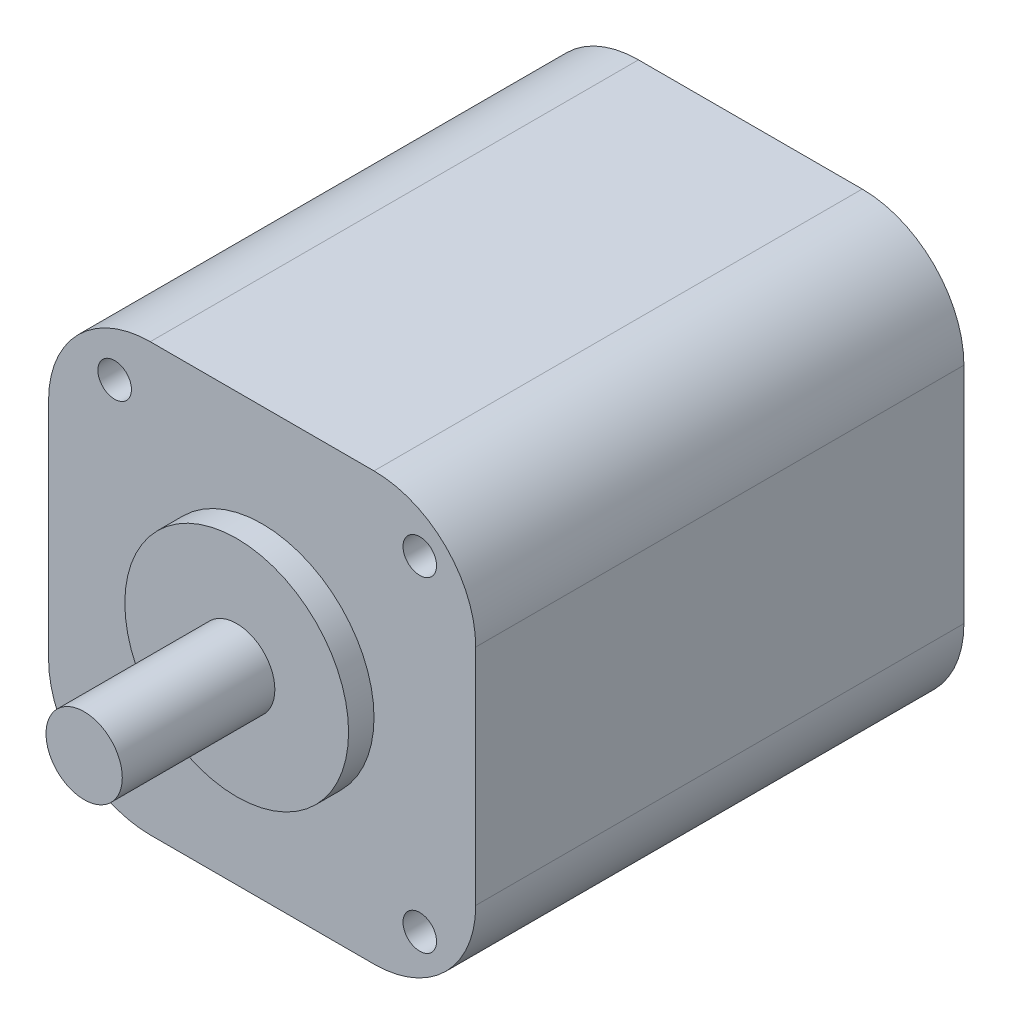
ISO-10303-21;
HEADER;
FILE_DESCRIPTION(('STEP AP214'),'2;1');
FILE_NAME('part.step','',(''),(''),'','','');
FILE_SCHEMA(('AUTOMOTIVE_DESIGN { 1 0 10303 214 1 1 1 1 }'));
ENDSEC;
DATA;
#1=APPLICATION_CONTEXT('core data for automotive mechanical design processes');
#2=APPLICATION_PROTOCOL_DEFINITION('international standard','automotive_design',2000,#1);
#3=PRODUCT_CONTEXT('',#1,'mechanical');
#4=PRODUCT('Part','Part','',(#3));
#5=PRODUCT_RELATED_PRODUCT_CATEGORY('part','',(#4));
#6=PRODUCT_DEFINITION_FORMATION('','',#4);
#7=PRODUCT_DEFINITION_CONTEXT('part definition',#1,'design');
#8=PRODUCT_DEFINITION('design','',#6,#7);
#9=PRODUCT_DEFINITION_SHAPE('','',#8);
#10=(LENGTH_UNIT() NAMED_UNIT(*) SI_UNIT(.MILLI.,.METRE.));
#11=(NAMED_UNIT(*) PLANE_ANGLE_UNIT() SI_UNIT($,.RADIAN.));
#12=(NAMED_UNIT(*) SI_UNIT($,.STERADIAN.) SOLID_ANGLE_UNIT());
#13=UNCERTAINTY_MEASURE_WITH_UNIT(LENGTH_MEASURE(1.E-05),#10,'distance_accuracy_value','');
#14=(GEOMETRIC_REPRESENTATION_CONTEXT(3) GLOBAL_UNCERTAINTY_ASSIGNED_CONTEXT((#13)) GLOBAL_UNIT_ASSIGNED_CONTEXT((#10,
#11,#12)) REPRESENTATION_CONTEXT('',''));
#15=CARTESIAN_POINT('',(0.,0.,0.));
#16=DIRECTION('',(0.,0.,1.));
#17=DIRECTION('',(1.,0.,0.));
#18=AXIS2_PLACEMENT_3D('',#15,#16,#17);
#19=CARTESIAN_POINT('',(-24.7390177664974,0.699593908629437,50.5));
#20=DIRECTION('',(0.,0.,1.));
#21=DIRECTION('',(1.,0.,0.));
#22=AXIS2_PLACEMENT_3D('',#19,#20,#21);
#23=PLANE('',#22);
#24=CARTESIAN_POINT('',(-24.7390177664974,0.699593908629437,50.5));
#25=DIRECTION('',(0.,0.,1.));
#26=DIRECTION('',(1.,0.,0.));
#27=AXIS2_PLACEMENT_3D('',#24,#25,#26);
#28=CIRCLE('',#27,11.);
#29=CARTESIAN_POINT('',(-13.7390177664974,0.699593908629437,50.5));
#30=VERTEX_POINT('',#29);
#31=EDGE_CURVE('E172',#30,#30,#28,.T.);
#32=ORIENTED_EDGE('',*,*,#31,.T.);
#33=EDGE_LOOP('',(#32));
#34=FACE_BOUND('',#33,.T.);
#35=CARTESIAN_POINT('',(-24.7390177664974,0.699593908629434,50.5));
#36=DIRECTION('',(0.,0.,1.));
#37=DIRECTION('',(1.,0.,0.));
#38=AXIS2_PLACEMENT_3D('',#35,#36,#37);
#39=CIRCLE('',#38,3.75);
#40=CARTESIAN_POINT('',(-20.9890177664974,0.699593908629434,50.5));
#41=VERTEX_POINT('',#40);
#42=EDGE_CURVE('E183',#41,#41,#39,.T.);
#43=ORIENTED_EDGE('',*,*,#42,.F.);
#44=EDGE_LOOP('',(#43));
#45=FACE_BOUND('',#44,.T.);
#46=ADVANCED_FACE('F31',(#34,#45),#23,.T.);
#47=CARTESIAN_POINT('',(-45.7390177664974,-20.3004060913706,48.));
#48=DIRECTION('',(0.,0.,1.));
#49=DIRECTION('',(1.,0.,0.));
#50=AXIS2_PLACEMENT_3D('',#47,#48,#49);
#51=PLANE('',#50);
#52=CARTESIAN_POINT('',(-9.23901776649741,16.6995939086294,48.));
#53=DIRECTION('',(0.,0.,1.));
#54=DIRECTION('',(1.,0.,0.));
#55=AXIS2_PLACEMENT_3D('',#52,#53,#54);
#56=CIRCLE('',#55,1.64999999999999);
#57=CARTESIAN_POINT('',(-7.58901776649742,16.6995939086294,48.));
#58=VERTEX_POINT('',#57);
#59=EDGE_CURVE('E206',#58,#58,#56,.T.);
#60=ORIENTED_EDGE('',*,*,#59,.F.);
#61=EDGE_LOOP('',(#60));
#62=FACE_BOUND('',#61,.T.);
#63=CARTESIAN_POINT('',(-9.23901776649741,-15.3004060913706,48.));
#64=DIRECTION('',(0.,0.,1.));
#65=DIRECTION('',(1.,0.,0.));
#66=AXIS2_PLACEMENT_3D('',#63,#64,#65);
#67=CIRCLE('',#66,1.64999999999999);
#68=CARTESIAN_POINT('',(-7.58901776649742,-15.3004060913706,48.));
#69=VERTEX_POINT('',#68);
#70=EDGE_CURVE('E200',#69,#69,#67,.T.);
#71=ORIENTED_EDGE('',*,*,#70,.F.);
#72=EDGE_LOOP('',(#71));
#73=FACE_BOUND('',#72,.T.);
#74=CARTESIAN_POINT('',(-39.2390177664974,-15.3004060913706,48.));
#75=DIRECTION('',(0.,0.,1.));
#76=DIRECTION('',(1.,0.,0.));
#77=AXIS2_PLACEMENT_3D('',#74,#75,#76);
#78=CIRCLE('',#77,1.64999999999998);
#79=CARTESIAN_POINT('',(-37.5890177664974,-15.3004060913706,48.));
#80=VERTEX_POINT('',#79);
#81=EDGE_CURVE('E194',#80,#80,#78,.T.);
#82=ORIENTED_EDGE('',*,*,#81,.F.);
#83=EDGE_LOOP('',(#82));
#84=FACE_BOUND('',#83,.T.);
#85=CARTESIAN_POINT('',(-39.2390177664974,16.6995939086294,48.));
#86=DIRECTION('',(0.,0.,1.));
#87=DIRECTION('',(1.,0.,0.));
#88=AXIS2_PLACEMENT_3D('',#85,#86,#87);
#89=CIRCLE('',#88,1.64999999999998);
#90=CARTESIAN_POINT('',(-37.5890177664974,16.6995939086294,48.));
#91=VERTEX_POINT('',#90);
#92=EDGE_CURVE('E186',#91,#91,#89,.T.);
#93=ORIENTED_EDGE('',*,*,#92,.F.);
#94=EDGE_LOOP('',(#93));
#95=FACE_BOUND('',#94,.T.);
#96=DIRECTION('',(1.,0.,0.));
#97=VECTOR('',#96,1.);
#98=CARTESIAN_POINT('',(-45.7390177664974,-20.3004060913706,48.));
#99=LINE('',#98,#97);
#100=CARTESIAN_POINT('',(-35.7390177664974,-20.3004060913706,48.));
#101=VERTEX_POINT('',#100);
#102=CARTESIAN_POINT('',(-13.7390177664974,-20.3004060913706,48.));
#103=VERTEX_POINT('',#102);
#104=EDGE_CURVE('E166',#101,#103,#99,.T.);
#105=ORIENTED_EDGE('',*,*,#104,.T.);
#106=CARTESIAN_POINT('',(-13.7390177664974,-10.3004060913706,48.));
#107=DIRECTION('',(0.,0.,1.));
#108=DIRECTION('',(1.,0.,0.));
#109=AXIS2_PLACEMENT_3D('',#106,#107,#108);
#110=CIRCLE('',#109,10.);
#111=CARTESIAN_POINT('',(-3.73901776649741,-10.3004060913705,48.));
#112=VERTEX_POINT('',#111);
#113=EDGE_CURVE('E145',#103,#112,#110,.T.);
#114=ORIENTED_EDGE('',*,*,#113,.T.);
#115=DIRECTION('',(0.,1.,0.));
#116=VECTOR('',#115,1.);
#117=CARTESIAN_POINT('',(-3.73901776649741,21.6995939086294,48.));
#118=LINE('',#117,#116);
#119=CARTESIAN_POINT('',(-3.73901776649741,11.6995939086294,48.));
#120=VERTEX_POINT('',#119);
#121=EDGE_CURVE('E116',#112,#120,#118,.T.);
#122=ORIENTED_EDGE('',*,*,#121,.T.);
#123=CARTESIAN_POINT('',(-13.7390177664974,11.6995939086294,48.));
#124=DIRECTION('',(0.,0.,1.));
#125=DIRECTION('',(1.,0.,0.));
#126=AXIS2_PLACEMENT_3D('',#123,#124,#125);
#127=CIRCLE('',#126,10.);
#128=CARTESIAN_POINT('',(-13.7390177664974,21.6995939086294,48.));
#129=VERTEX_POINT('',#128);
#130=EDGE_CURVE('E52',#120,#129,#127,.T.);
#131=ORIENTED_EDGE('',*,*,#130,.T.);
#132=DIRECTION('',(-1.,0.,0.));
#133=VECTOR('',#132,1.);
#134=CARTESIAN_POINT('',(-45.7390177664974,21.6995939086294,48.));
#135=LINE('',#134,#133);
#136=CARTESIAN_POINT('',(-35.7390177664974,21.6995939086294,48.));
#137=VERTEX_POINT('',#136);
#138=EDGE_CURVE('E132',#129,#137,#135,.T.);
#139=ORIENTED_EDGE('',*,*,#138,.T.);
#140=CARTESIAN_POINT('',(-35.7390177664974,11.6995939086294,48.));
#141=DIRECTION('',(0.,0.,1.));
#142=DIRECTION('',(1.,0.,0.));
#143=AXIS2_PLACEMENT_3D('',#140,#141,#142);
#144=CIRCLE('',#143,10.);
#145=CARTESIAN_POINT('',(-45.7390177664974,11.6995939086294,48.));
#146=VERTEX_POINT('',#145);
#147=EDGE_CURVE('E140',#137,#146,#144,.T.);
#148=ORIENTED_EDGE('',*,*,#147,.T.);
#149=DIRECTION('',(0.,-1.,0.));
#150=VECTOR('',#149,1.);
#151=CARTESIAN_POINT('',(-45.7390177664974,21.6995939086294,48.));
#152=LINE('',#151,#150);
#153=CARTESIAN_POINT('',(-45.7390177664974,-10.3004060913706,48.));
#154=VERTEX_POINT('',#153);
#155=EDGE_CURVE('E126',#146,#154,#152,.T.);
#156=ORIENTED_EDGE('',*,*,#155,.T.);
#157=CARTESIAN_POINT('',(-35.7390177664974,-10.3004060913706,48.));
#158=DIRECTION('',(0.,0.,1.));
#159=DIRECTION('',(1.,0.,0.));
#160=AXIS2_PLACEMENT_3D('',#157,#158,#159);
#161=CIRCLE('',#160,10.);
#162=EDGE_CURVE('E143',#154,#101,#161,.T.);
#163=ORIENTED_EDGE('',*,*,#162,.T.);
#164=EDGE_LOOP('',(#105,#114,#122,#131,#139,#148,#156,#163));
#165=FACE_BOUND('',#164,.T.);
#166=CARTESIAN_POINT('',(-24.7390177664974,0.699593908629437,48.));
#167=DIRECTION('',(0.,0.,1.));
#168=DIRECTION('',(1.,0.,0.));
#169=AXIS2_PLACEMENT_3D('',#166,#167,#168);
#170=CIRCLE('',#169,11.);
#171=CARTESIAN_POINT('',(-13.7390177664974,0.699593908629437,48.));
#172=VERTEX_POINT('',#171);
#173=EDGE_CURVE('E174',#172,#172,#170,.T.);
#174=ORIENTED_EDGE('',*,*,#173,.F.);
#175=EDGE_LOOP('',(#174));
#176=FACE_BOUND('',#175,.T.);
#177=ADVANCED_FACE('F162',(#62,#73,#84,#95,#165,#176),#51,.T.);
#178=CARTESIAN_POINT('',(-45.7390177664974,21.6995939086294,48.));
#179=DIRECTION('',(1.,0.,0.));
#180=DIRECTION('',(0.,1.,0.));
#181=AXIS2_PLACEMENT_3D('',#178,#179,#180);
#182=PLANE('',#181);
#183=DIRECTION('',(0.,-1.,0.));
#184=VECTOR('',#183,1.);
#185=CARTESIAN_POINT('',(-45.7390177664974,21.6995939086294,0.));
#186=LINE('',#185,#184);
#187=CARTESIAN_POINT('',(-45.7390177664974,11.6995939086294,0.));
#188=VERTEX_POINT('',#187);
#189=CARTESIAN_POINT('',(-45.7390177664974,-10.3004060913706,0.));
#190=VERTEX_POINT('',#189);
#191=EDGE_CURVE('E128',#188,#190,#186,.T.);
#192=ORIENTED_EDGE('',*,*,#191,.T.);
#193=DIRECTION('',(0.,0.,-1.));
#194=VECTOR('',#193,1.);
#195=CARTESIAN_POINT('',(-45.7390177664974,-10.3004060913706,48.));
#196=LINE('',#195,#194);
#197=EDGE_CURVE('E150',#190,#154,#196,.F.);
#198=ORIENTED_EDGE('',*,*,#197,.T.);
#199=ORIENTED_EDGE('',*,*,#155,.F.);
#200=DIRECTION('',(0.,0.,-1.));
#201=VECTOR('',#200,1.);
#202=CARTESIAN_POINT('',(-45.7390177664974,11.6995939086294,48.));
#203=LINE('',#202,#201);
#204=EDGE_CURVE('E147',#146,#188,#203,.T.);
#205=ORIENTED_EDGE('',*,*,#204,.T.);
#206=EDGE_LOOP('',(#192,#198,#199,#205));
#207=FACE_BOUND('',#206,.T.);
#208=ADVANCED_FACE('F156',(#207),#182,.F.);
#209=CARTESIAN_POINT('',(-45.7390177664974,-20.3004060913706,48.));
#210=DIRECTION('',(0.,1.,0.));
#211=DIRECTION('',(0.,0.,1.));
#212=AXIS2_PLACEMENT_3D('',#209,#210,#211);
#213=PLANE('',#212);
#214=DIRECTION('',(1.,0.,0.));
#215=VECTOR('',#214,1.);
#216=CARTESIAN_POINT('',(-45.7390177664974,-20.3004060913706,0.));
#217=LINE('',#216,#215);
#218=CARTESIAN_POINT('',(-35.7390177664974,-20.3004060913706,0.));
#219=VERTEX_POINT('',#218);
#220=CARTESIAN_POINT('',(-13.7390177664974,-20.3004060913706,0.));
#221=VERTEX_POINT('',#220);
#222=EDGE_CURVE('E124',#219,#221,#217,.T.);
#223=ORIENTED_EDGE('',*,*,#222,.T.);
#224=DIRECTION('',(0.,0.,-1.));
#225=VECTOR('',#224,1.);
#226=CARTESIAN_POINT('',(-13.7390177664974,-20.3004060913706,48.));
#227=LINE('',#226,#225);
#228=EDGE_CURVE('E102',#221,#103,#227,.F.);
#229=ORIENTED_EDGE('',*,*,#228,.T.);
#230=ORIENTED_EDGE('',*,*,#104,.F.);
#231=DIRECTION('',(0.,0.,-1.));
#232=VECTOR('',#231,1.);
#233=CARTESIAN_POINT('',(-35.7390177664974,-20.3004060913706,48.));
#234=LINE('',#233,#232);
#235=EDGE_CURVE('E107',#101,#219,#234,.T.);
#236=ORIENTED_EDGE('',*,*,#235,.T.);
#237=EDGE_LOOP('',(#223,#229,#230,#236));
#238=FACE_BOUND('',#237,.T.);
#239=ADVANCED_FACE('F171',(#238),#213,.F.);
#240=CARTESIAN_POINT('',(-3.73901776649741,21.6995939086294,48.));
#241=DIRECTION('',(-1.,0.,0.));
#242=DIRECTION('',(0.,-1.,0.));
#243=AXIS2_PLACEMENT_3D('',#240,#241,#242);
#244=PLANE('',#243);
#245=ORIENTED_EDGE('',*,*,#121,.F.);
#246=DIRECTION('',(0.,0.,-1.));
#247=VECTOR('',#246,1.);
#248=CARTESIAN_POINT('',(-3.73901776649741,-10.3004060913706,48.));
#249=LINE('',#248,#247);
#250=CARTESIAN_POINT('',(-3.73901776649741,-10.3004060913705,0.));
#251=VERTEX_POINT('',#250);
#252=EDGE_CURVE('E101',#112,#251,#249,.T.);
#253=ORIENTED_EDGE('',*,*,#252,.T.);
#254=DIRECTION('',(0.,1.,0.));
#255=VECTOR('',#254,1.);
#256=CARTESIAN_POINT('',(-3.73901776649741,21.6995939086294,0.));
#257=LINE('',#256,#255);
#258=CARTESIAN_POINT('',(-3.73901776649741,11.6995939086294,0.));
#259=VERTEX_POINT('',#258);
#260=EDGE_CURVE('E114',#251,#259,#257,.T.);
#261=ORIENTED_EDGE('',*,*,#260,.T.);
#262=DIRECTION('',(0.,0.,-1.));
#263=VECTOR('',#262,1.);
#264=CARTESIAN_POINT('',(-3.73901776649741,11.6995939086294,48.));
#265=LINE('',#264,#263);
#266=EDGE_CURVE('E118',#259,#120,#265,.F.);
#267=ORIENTED_EDGE('',*,*,#266,.T.);
#268=EDGE_LOOP('',(#245,#253,#261,#267));
#269=FACE_BOUND('',#268,.T.);
#270=ADVANCED_FACE('F113',(#269),#244,.F.);
#271=CARTESIAN_POINT('',(-45.7390177664974,21.6995939086294,48.));
#272=DIRECTION('',(0.,-1.,0.));
#273=DIRECTION('',(0.,0.,-1.));
#274=AXIS2_PLACEMENT_3D('',#271,#272,#273);
#275=PLANE('',#274);
#276=ORIENTED_EDGE('',*,*,#138,.F.);
#277=DIRECTION('',(0.,0.,-1.));
#278=VECTOR('',#277,1.);
#279=CARTESIAN_POINT('',(-13.7390177664974,21.6995939086294,48.));
#280=LINE('',#279,#278);
#281=CARTESIAN_POINT('',(-13.7390177664974,21.6995939086294,0.));
#282=VERTEX_POINT('',#281);
#283=EDGE_CURVE('E11',#129,#282,#280,.T.);
#284=ORIENTED_EDGE('',*,*,#283,.T.);
#285=DIRECTION('',(-1.,0.,0.));
#286=VECTOR('',#285,1.);
#287=CARTESIAN_POINT('',(-45.7390177664974,21.6995939086294,0.));
#288=LINE('',#287,#286);
#289=CARTESIAN_POINT('',(-35.7390177664974,21.6995939086294,0.));
#290=VERTEX_POINT('',#289);
#291=EDGE_CURVE('E123',#282,#290,#288,.T.);
#292=ORIENTED_EDGE('',*,*,#291,.T.);
#293=DIRECTION('',(0.,0.,-1.));
#294=VECTOR('',#293,1.);
#295=CARTESIAN_POINT('',(-35.7390177664974,21.6995939086294,48.));
#296=LINE('',#295,#294);
#297=EDGE_CURVE('E39',#290,#137,#296,.F.);
#298=ORIENTED_EDGE('',*,*,#297,.T.);
#299=EDGE_LOOP('',(#276,#284,#292,#298));
#300=FACE_BOUND('',#299,.T.);
#301=ADVANCED_FACE('F217',(#300),#275,.F.);
#302=CARTESIAN_POINT('',(-45.7390177664974,-20.3004060913706,0.));
#303=DIRECTION('',(0.,0.,1.));
#304=DIRECTION('',(1.,0.,0.));
#305=AXIS2_PLACEMENT_3D('',#302,#303,#304);
#306=PLANE('',#305);
#307=CARTESIAN_POINT('',(-9.23901776649741,16.6995939086294,0.));
#308=DIRECTION('',(0.,0.,-1.));
#309=DIRECTION('',(-1.,0.,0.));
#310=AXIS2_PLACEMENT_3D('',#307,#308,#309);
#311=CIRCLE('',#310,1.64999999999999);
#312=CARTESIAN_POINT('',(-10.8890177664974,16.6995939086294,0.));
#313=VERTEX_POINT('',#312);
#314=EDGE_CURVE('E209',#313,#313,#311,.T.);
#315=ORIENTED_EDGE('',*,*,#314,.F.);
#316=EDGE_LOOP('',(#315));
#317=FACE_BOUND('',#316,.T.);
#318=CARTESIAN_POINT('',(-9.23901776649741,-15.3004060913706,0.));
#319=DIRECTION('',(0.,0.,-1.));
#320=DIRECTION('',(-1.,0.,0.));
#321=AXIS2_PLACEMENT_3D('',#318,#319,#320);
#322=CIRCLE('',#321,1.64999999999999);
#323=CARTESIAN_POINT('',(-10.8890177664974,-15.3004060913706,0.));
#324=VERTEX_POINT('',#323);
#325=EDGE_CURVE('E203',#324,#324,#322,.T.);
#326=ORIENTED_EDGE('',*,*,#325,.F.);
#327=EDGE_LOOP('',(#326));
#328=FACE_BOUND('',#327,.T.);
#329=CARTESIAN_POINT('',(-39.2390177664974,-15.3004060913706,0.));
#330=DIRECTION('',(0.,0.,-1.));
#331=DIRECTION('',(-1.,0.,0.));
#332=AXIS2_PLACEMENT_3D('',#329,#330,#331);
#333=CIRCLE('',#332,1.64999999999998);
#334=CARTESIAN_POINT('',(-40.8890177664974,-15.3004060913706,0.));
#335=VERTEX_POINT('',#334);
#336=EDGE_CURVE('E197',#335,#335,#333,.T.);
#337=ORIENTED_EDGE('',*,*,#336,.F.);
#338=EDGE_LOOP('',(#337));
#339=FACE_BOUND('',#338,.T.);
#340=CARTESIAN_POINT('',(-39.2390177664974,16.6995939086294,0.));
#341=DIRECTION('',(0.,0.,-1.));
#342=DIRECTION('',(-1.,0.,0.));
#343=AXIS2_PLACEMENT_3D('',#340,#341,#342);
#344=CIRCLE('',#343,1.64999999999998);
#345=CARTESIAN_POINT('',(-40.8890177664974,16.6995939086294,0.));
#346=VERTEX_POINT('',#345);
#347=EDGE_CURVE('E191',#346,#346,#344,.T.);
#348=ORIENTED_EDGE('',*,*,#347,.F.);
#349=EDGE_LOOP('',(#348));
#350=FACE_BOUND('',#349,.T.);
#351=ORIENTED_EDGE('',*,*,#260,.F.);
#352=CARTESIAN_POINT('',(-13.7390177664974,-10.3004060913706,0.));
#353=DIRECTION('',(0.,0.,1.));
#354=DIRECTION('',(1.,0.,0.));
#355=AXIS2_PLACEMENT_3D('',#352,#353,#354);
#356=CIRCLE('',#355,10.);
#357=EDGE_CURVE('E97',#251,#221,#356,.F.);
#358=ORIENTED_EDGE('',*,*,#357,.T.);
#359=ORIENTED_EDGE('',*,*,#222,.F.);
#360=CARTESIAN_POINT('',(-35.7390177664974,-10.3004060913706,0.));
#361=DIRECTION('',(0.,0.,1.));
#362=DIRECTION('',(1.,0.,0.));
#363=AXIS2_PLACEMENT_3D('',#360,#361,#362);
#364=CIRCLE('',#363,10.);
#365=EDGE_CURVE('E108',#219,#190,#364,.F.);
#366=ORIENTED_EDGE('',*,*,#365,.T.);
#367=ORIENTED_EDGE('',*,*,#191,.F.);
#368=CARTESIAN_POINT('',(-35.7390177664974,11.6995939086294,0.));
#369=DIRECTION('',(0.,0.,1.));
#370=DIRECTION('',(1.,0.,0.));
#371=AXIS2_PLACEMENT_3D('',#368,#369,#370);
#372=CIRCLE('',#371,10.);
#373=EDGE_CURVE('E117',#188,#290,#372,.F.);
#374=ORIENTED_EDGE('',*,*,#373,.T.);
#375=ORIENTED_EDGE('',*,*,#291,.F.);
#376=CARTESIAN_POINT('',(-13.7390177664974,11.6995939086294,0.));
#377=DIRECTION('',(0.,0.,1.));
#378=DIRECTION('',(1.,0.,0.));
#379=AXIS2_PLACEMENT_3D('',#376,#377,#378);
#380=CIRCLE('',#379,10.);
#381=EDGE_CURVE('E122',#282,#259,#380,.F.);
#382=ORIENTED_EDGE('',*,*,#381,.T.);
#383=EDGE_LOOP('',(#351,#358,#359,#366,#367,#374,#375,#382));
#384=FACE_BOUND('',#383,.T.);
#385=ADVANCED_FACE('F120',(#317,#328,#339,#350,#384),#306,.F.);
#386=CARTESIAN_POINT('',(-13.7390177664974,-10.3004060913706,48.));
#387=DIRECTION('',(0.,0.,-1.));
#388=DIRECTION('',(-1.,0.,0.));
#389=AXIS2_PLACEMENT_3D('',#386,#387,#388);
#390=CYLINDRICAL_SURFACE('',#389,10.);
#391=ORIENTED_EDGE('',*,*,#113,.F.);
#392=ORIENTED_EDGE('',*,*,#228,.F.);
#393=ORIENTED_EDGE('',*,*,#357,.F.);
#394=ORIENTED_EDGE('',*,*,#252,.F.);
#395=EDGE_LOOP('',(#391,#392,#393,#394));
#396=FACE_BOUND('',#395,.T.);
#397=ADVANCED_FACE('F100',(#396),#390,.T.);
#398=CARTESIAN_POINT('',(-35.7390177664974,-10.3004060913706,48.));
#399=DIRECTION('',(0.,0.,-1.));
#400=DIRECTION('',(-1.,0.,0.));
#401=AXIS2_PLACEMENT_3D('',#398,#399,#400);
#402=CYLINDRICAL_SURFACE('',#401,10.);
#403=ORIENTED_EDGE('',*,*,#162,.F.);
#404=ORIENTED_EDGE('',*,*,#197,.F.);
#405=ORIENTED_EDGE('',*,*,#365,.F.);
#406=ORIENTED_EDGE('',*,*,#235,.F.);
#407=EDGE_LOOP('',(#403,#404,#405,#406));
#408=FACE_BOUND('',#407,.T.);
#409=ADVANCED_FACE('F169',(#408),#402,.T.);
#410=CARTESIAN_POINT('',(-13.7390177664974,11.6995939086294,48.));
#411=DIRECTION('',(0.,0.,-1.));
#412=DIRECTION('',(-1.,0.,0.));
#413=AXIS2_PLACEMENT_3D('',#410,#411,#412);
#414=CYLINDRICAL_SURFACE('',#413,10.);
#415=ORIENTED_EDGE('',*,*,#130,.F.);
#416=ORIENTED_EDGE('',*,*,#266,.F.);
#417=ORIENTED_EDGE('',*,*,#381,.F.);
#418=ORIENTED_EDGE('',*,*,#283,.F.);
#419=EDGE_LOOP('',(#415,#416,#417,#418));
#420=FACE_BOUND('',#419,.T.);
#421=ADVANCED_FACE('F268',(#420),#414,.T.);
#422=CARTESIAN_POINT('',(-35.7390177664974,11.6995939086294,48.));
#423=DIRECTION('',(0.,0.,-1.));
#424=DIRECTION('',(-1.,0.,0.));
#425=AXIS2_PLACEMENT_3D('',#422,#423,#424);
#426=CYLINDRICAL_SURFACE('',#425,10.);
#427=ORIENTED_EDGE('',*,*,#147,.F.);
#428=ORIENTED_EDGE('',*,*,#297,.F.);
#429=ORIENTED_EDGE('',*,*,#373,.F.);
#430=ORIENTED_EDGE('',*,*,#204,.F.);
#431=EDGE_LOOP('',(#427,#428,#429,#430));
#432=FACE_BOUND('',#431,.T.);
#433=ADVANCED_FACE('F33',(#432),#426,.T.);
#434=CARTESIAN_POINT('',(-24.7390177664974,0.699593908629437,50.5));
#435=DIRECTION('',(0.,0.,-1.));
#436=DIRECTION('',(-1.,0.,0.));
#437=AXIS2_PLACEMENT_3D('',#434,#435,#436);
#438=CYLINDRICAL_SURFACE('',#437,11.);
#439=ORIENTED_EDGE('',*,*,#31,.F.);
#440=EDGE_LOOP('',(#439));
#441=FACE_BOUND('',#440,.T.);
#442=ORIENTED_EDGE('',*,*,#173,.T.);
#443=EDGE_LOOP('',(#442));
#444=FACE_BOUND('',#443,.T.);
#445=ADVANCED_FACE('F253',(#441,#444),#438,.T.);
#446=CARTESIAN_POINT('',(-24.7390177664974,0.699593908629434,65.5));
#447=DIRECTION('',(0.,0.,-1.));
#448=DIRECTION('',(-1.,0.,0.));
#449=AXIS2_PLACEMENT_3D('',#446,#447,#448);
#450=CYLINDRICAL_SURFACE('',#449,3.75);
#451=CARTESIAN_POINT('',(-24.7390177664974,0.699593908629434,65.5));
#452=DIRECTION('',(0.,0.,1.));
#453=DIRECTION('',(1.,0.,0.));
#454=AXIS2_PLACEMENT_3D('',#451,#452,#453);
#455=CIRCLE('',#454,3.75);
#456=CARTESIAN_POINT('',(-20.9890177664974,0.699593908629434,65.5));
#457=VERTEX_POINT('',#456);
#458=EDGE_CURVE('E181',#457,#457,#455,.T.);
#459=ORIENTED_EDGE('',*,*,#458,.F.);
#460=EDGE_LOOP('',(#459));
#461=FACE_BOUND('',#460,.T.);
#462=ORIENTED_EDGE('',*,*,#42,.T.);
#463=EDGE_LOOP('',(#462));
#464=FACE_BOUND('',#463,.T.);
#465=ADVANCED_FACE('F238',(#461,#464),#450,.T.);
#466=CARTESIAN_POINT('',(-24.7390177664974,0.699593908629434,65.5));
#467=DIRECTION('',(0.,0.,1.));
#468=DIRECTION('',(1.,0.,0.));
#469=AXIS2_PLACEMENT_3D('',#466,#467,#468);
#470=PLANE('',#469);
#471=ORIENTED_EDGE('',*,*,#458,.T.);
#472=EDGE_LOOP('',(#471));
#473=FACE_BOUND('',#472,.T.);
#474=ADVANCED_FACE('F228',(#473),#470,.T.);
#475=CARTESIAN_POINT('',(-39.2390177664974,16.6995939086294,0.));
#476=DIRECTION('',(0.,0.,-1.));
#477=DIRECTION('',(-1.,0.,0.));
#478=AXIS2_PLACEMENT_3D('',#475,#476,#477);
#479=CYLINDRICAL_SURFACE('',#478,1.64999999999998);
#480=ORIENTED_EDGE('',*,*,#92,.T.);
#481=EDGE_LOOP('',(#480));
#482=FACE_BOUND('',#481,.T.);
#483=ORIENTED_EDGE('',*,*,#347,.T.);
#484=EDGE_LOOP('',(#483));
#485=FACE_BOUND('',#484,.T.);
#486=ADVANCED_FACE('F225',(#482,#485),#479,.F.);
#487=CARTESIAN_POINT('',(-39.2390177664974,-15.3004060913706,0.));
#488=DIRECTION('',(0.,0.,-1.));
#489=DIRECTION('',(-1.,0.,0.));
#490=AXIS2_PLACEMENT_3D('',#487,#488,#489);
#491=CYLINDRICAL_SURFACE('',#490,1.64999999999998);
#492=ORIENTED_EDGE('',*,*,#81,.T.);
#493=EDGE_LOOP('',(#492));
#494=FACE_BOUND('',#493,.T.);
#495=ORIENTED_EDGE('',*,*,#336,.T.);
#496=EDGE_LOOP('',(#495));
#497=FACE_BOUND('',#496,.T.);
#498=ADVANCED_FACE('F227',(#494,#497),#491,.F.);
#499=CARTESIAN_POINT('',(-9.23901776649741,-15.3004060913706,0.));
#500=DIRECTION('',(0.,0.,-1.));
#501=DIRECTION('',(-1.,0.,0.));
#502=AXIS2_PLACEMENT_3D('',#499,#500,#501);
#503=CYLINDRICAL_SURFACE('',#502,1.64999999999999);
#504=ORIENTED_EDGE('',*,*,#70,.T.);
#505=EDGE_LOOP('',(#504));
#506=FACE_BOUND('',#505,.T.);
#507=ORIENTED_EDGE('',*,*,#325,.T.);
#508=EDGE_LOOP('',(#507));
#509=FACE_BOUND('',#508,.T.);
#510=ADVANCED_FACE('F235',(#506,#509),#503,.F.);
#511=CARTESIAN_POINT('',(-9.23901776649741,16.6995939086294,0.));
#512=DIRECTION('',(0.,0.,-1.));
#513=DIRECTION('',(-1.,0.,0.));
#514=AXIS2_PLACEMENT_3D('',#511,#512,#513);
#515=CYLINDRICAL_SURFACE('',#514,1.64999999999999);
#516=ORIENTED_EDGE('',*,*,#59,.T.);
#517=EDGE_LOOP('',(#516));
#518=FACE_BOUND('',#517,.T.);
#519=ORIENTED_EDGE('',*,*,#314,.T.);
#520=EDGE_LOOP('',(#519));
#521=FACE_BOUND('',#520,.T.);
#522=ADVANCED_FACE('F213',(#518,#521),#515,.F.);
#523=CLOSED_SHELL('',(#46,#177,#208,#239,#270,#301,#385,#397,#409,#421,#433,#445,#465,#474,#486,
#498,#510,#522));
#524=MANIFOLD_SOLID_BREP('B2',#523);
#525=ADVANCED_BREP_SHAPE_REPRESENTATION('',(#18,#524),#14);
#526=SHAPE_DEFINITION_REPRESENTATION(#9,#525);
ENDSEC;
END-ISO-10303-21;
